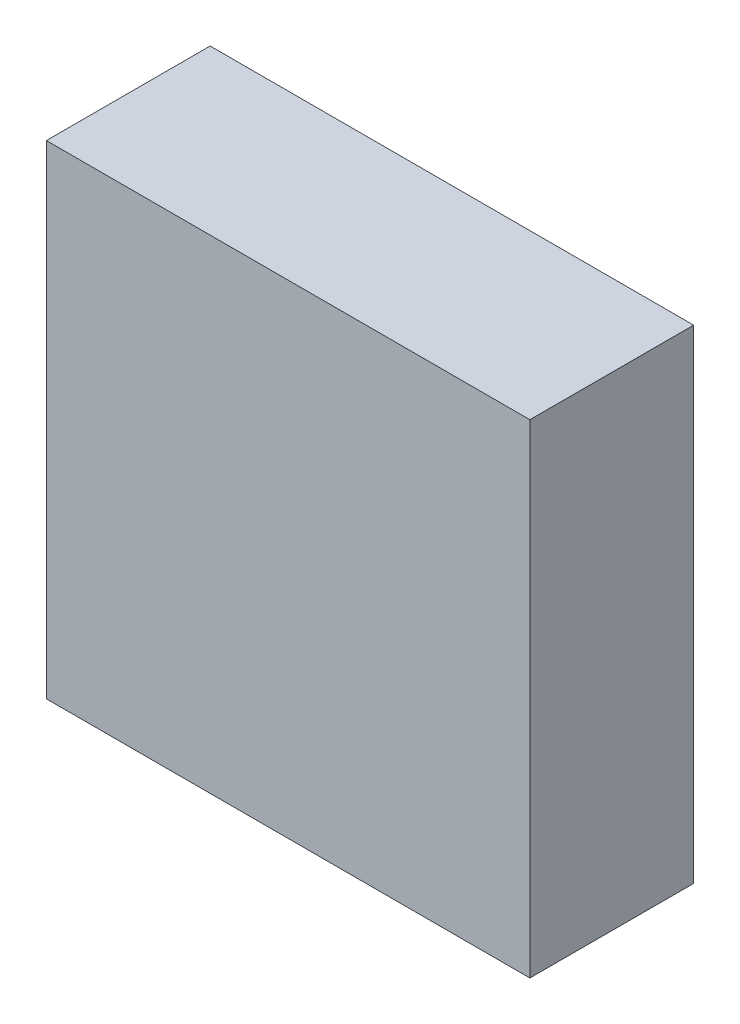
ISO-10303-21;
HEADER;
FILE_DESCRIPTION(('STEP AP214'),'2;1');
FILE_NAME('part.step','',(''),(''),'','','');
FILE_SCHEMA(('AUTOMOTIVE_DESIGN { 1 0 10303 214 1 1 1 1 }'));
ENDSEC;
DATA;
#1=APPLICATION_CONTEXT('core data for automotive mechanical design processes');
#2=APPLICATION_PROTOCOL_DEFINITION('international standard','automotive_design',2000,#1);
#3=PRODUCT_CONTEXT('',#1,'mechanical');
#4=PRODUCT('Part','Part','',(#3));
#5=PRODUCT_RELATED_PRODUCT_CATEGORY('part','',(#4));
#6=PRODUCT_DEFINITION_FORMATION('','',#4);
#7=PRODUCT_DEFINITION_CONTEXT('part definition',#1,'design');
#8=PRODUCT_DEFINITION('design','',#6,#7);
#9=PRODUCT_DEFINITION_SHAPE('','',#8);
#10=(LENGTH_UNIT() NAMED_UNIT(*) SI_UNIT(.MILLI.,.METRE.));
#11=(NAMED_UNIT(*) PLANE_ANGLE_UNIT() SI_UNIT($,.RADIAN.));
#12=(NAMED_UNIT(*) SI_UNIT($,.STERADIAN.) SOLID_ANGLE_UNIT());
#13=UNCERTAINTY_MEASURE_WITH_UNIT(LENGTH_MEASURE(1.E-05),#10,'distance_accuracy_value','');
#14=(GEOMETRIC_REPRESENTATION_CONTEXT(3) GLOBAL_UNCERTAINTY_ASSIGNED_CONTEXT((#13)) GLOBAL_UNIT_ASSIGNED_CONTEXT((#10,
#11,#12)) REPRESENTATION_CONTEXT('',''));
#15=CARTESIAN_POINT('',(0.,0.,0.));
#16=DIRECTION('',(0.,0.,1.));
#17=DIRECTION('',(1.,0.,0.));
#18=AXIS2_PLACEMENT_3D('',#15,#16,#17);
#19=CARTESIAN_POINT('',(-1.54999944,-1.54999944,1.05000044));
#20=DIRECTION('',(0.,0.,-1.));
#21=DIRECTION('',(-1.,0.,0.));
#22=AXIS2_PLACEMENT_3D('',#19,#20,#21);
#23=PLANE('',#22);
#24=DIRECTION('',(0.,1.,0.));
#25=VECTOR('',#24,1.);
#26=CARTESIAN_POINT('',(1.54999944,-1.54999944,1.05000044));
#27=LINE('',#26,#25);
#28=CARTESIAN_POINT('',(1.54999944,-1.54999944,1.05000044));
#29=VERTEX_POINT('',#28);
#30=CARTESIAN_POINT('',(1.54999944,1.55000198,1.05000044));
#31=VERTEX_POINT('',#30);
#32=EDGE_CURVE('E55',#29,#31,#27,.T.);
#33=ORIENTED_EDGE('',*,*,#32,.T.);
#34=DIRECTION('',(1.,0.,0.));
#35=VECTOR('',#34,1.);
#36=CARTESIAN_POINT('',(1.54999944,1.55000198,1.05000044));
#37=LINE('',#36,#35);
#38=CARTESIAN_POINT('',(-1.54999944,1.55000198,1.05000044));
#39=VERTEX_POINT('',#38);
#40=EDGE_CURVE('E57',#31,#39,#37,.F.);
#41=ORIENTED_EDGE('',*,*,#40,.T.);
#42=DIRECTION('',(0.,1.,0.));
#43=VECTOR('',#42,1.);
#44=CARTESIAN_POINT('',(-1.54999944,1.55000198,1.05000044));
#45=LINE('',#44,#43);
#46=CARTESIAN_POINT('',(-1.54999944,-1.54999944,1.05000044));
#47=VERTEX_POINT('',#46);
#48=EDGE_CURVE('E20',#39,#47,#45,.F.);
#49=ORIENTED_EDGE('',*,*,#48,.T.);
#50=DIRECTION('',(1.,0.,0.));
#51=VECTOR('',#50,1.);
#52=CARTESIAN_POINT('',(-1.54999944,-1.54999944,1.05000044));
#53=LINE('',#52,#51);
#54=EDGE_CURVE('E80',#47,#29,#53,.T.);
#55=ORIENTED_EDGE('',*,*,#54,.T.);
#56=EDGE_LOOP('',(#33,#41,#49,#55));
#57=FACE_BOUND('',#56,.T.);
#58=ADVANCED_FACE('F17',(#57),#23,.F.);
#59=CARTESIAN_POINT('',(-1.54999944,1.55000198,0.));
#60=DIRECTION('',(1.,0.,0.));
#61=DIRECTION('',(0.,0.,-1.));
#62=AXIS2_PLACEMENT_3D('',#59,#60,#61);
#63=PLANE('',#62);
#64=DIRECTION('',(0.,0.,1.));
#65=VECTOR('',#64,1.);
#66=CARTESIAN_POINT('',(-1.54999944,-1.54999944,0.));
#67=LINE('',#66,#65);
#68=CARTESIAN_POINT('',(-1.54999944,-1.54999944,0.));
#69=VERTEX_POINT('',#68);
#70=EDGE_CURVE('E68',#69,#47,#67,.T.);
#71=ORIENTED_EDGE('',*,*,#70,.T.);
#72=ORIENTED_EDGE('',*,*,#48,.F.);
#73=DIRECTION('',(0.,0.,-1.));
#74=VECTOR('',#73,1.);
#75=CARTESIAN_POINT('',(-1.54999944,1.55000198,0.));
#76=LINE('',#75,#74);
#77=CARTESIAN_POINT('',(-1.54999944,1.55000198,0.));
#78=VERTEX_POINT('',#77);
#79=EDGE_CURVE('E63',#39,#78,#76,.T.);
#80=ORIENTED_EDGE('',*,*,#79,.T.);
#81=DIRECTION('',(0.,1.,0.));
#82=VECTOR('',#81,1.);
#83=CARTESIAN_POINT('',(-1.54999944,-1.54999944,0.));
#84=LINE('',#83,#82);
#85=EDGE_CURVE('E83',#69,#78,#84,.T.);
#86=ORIENTED_EDGE('',*,*,#85,.F.);
#87=EDGE_LOOP('',(#71,#72,#80,#86));
#88=FACE_BOUND('',#87,.T.);
#89=ADVANCED_FACE('F65',(#88),#63,.F.);
#90=CARTESIAN_POINT('',(1.54999944,1.55000198,0.));
#91=DIRECTION('',(0.,-1.,0.));
#92=DIRECTION('',(0.,0.,-1.));
#93=AXIS2_PLACEMENT_3D('',#90,#91,#92);
#94=PLANE('',#93);
#95=ORIENTED_EDGE('',*,*,#79,.F.);
#96=ORIENTED_EDGE('',*,*,#40,.F.);
#97=DIRECTION('',(0.,0.,1.));
#98=VECTOR('',#97,1.);
#99=CARTESIAN_POINT('',(1.54999944,1.55000198,0.));
#100=LINE('',#99,#98);
#101=CARTESIAN_POINT('',(1.54999944,1.55000198,0.));
#102=VERTEX_POINT('',#101);
#103=EDGE_CURVE('E75',#31,#102,#100,.F.);
#104=ORIENTED_EDGE('',*,*,#103,.T.);
#105=DIRECTION('',(-1.,0.,0.));
#106=VECTOR('',#105,1.);
#107=CARTESIAN_POINT('',(-1.54999944,1.55000198,0.));
#108=LINE('',#107,#106);
#109=EDGE_CURVE('E72',#78,#102,#108,.F.);
#110=ORIENTED_EDGE('',*,*,#109,.F.);
#111=EDGE_LOOP('',(#95,#96,#104,#110));
#112=FACE_BOUND('',#111,.T.);
#113=ADVANCED_FACE('F70',(#112),#94,.F.);
#114=CARTESIAN_POINT('',(1.54999944,-1.54999944,0.));
#115=DIRECTION('',(-1.,0.,0.));
#116=DIRECTION('',(0.,0.,1.));
#117=AXIS2_PLACEMENT_3D('',#114,#115,#116);
#118=PLANE('',#117);
#119=ORIENTED_EDGE('',*,*,#103,.F.);
#120=ORIENTED_EDGE('',*,*,#32,.F.);
#121=DIRECTION('',(0.,0.,1.));
#122=VECTOR('',#121,1.);
#123=CARTESIAN_POINT('',(1.54999944,-1.54999944,0.));
#124=LINE('',#123,#122);
#125=CARTESIAN_POINT('',(1.54999944,-1.54999944,0.));
#126=VERTEX_POINT('',#125);
#127=EDGE_CURVE('E35',#29,#126,#124,.F.);
#128=ORIENTED_EDGE('',*,*,#127,.T.);
#129=DIRECTION('',(0.,1.,0.));
#130=VECTOR('',#129,1.);
#131=CARTESIAN_POINT('',(1.54999944,-1.54999944,0.));
#132=LINE('',#131,#130);
#133=EDGE_CURVE('E26',#102,#126,#132,.F.);
#134=ORIENTED_EDGE('',*,*,#133,.F.);
#135=EDGE_LOOP('',(#119,#120,#128,#134));
#136=FACE_BOUND('',#135,.T.);
#137=ADVANCED_FACE('F89',(#136),#118,.F.);
#138=CARTESIAN_POINT('',(-1.54999944,-1.54999944,0.));
#139=DIRECTION('',(0.,1.,0.));
#140=DIRECTION('',(0.,0.,1.));
#141=AXIS2_PLACEMENT_3D('',#138,#139,#140);
#142=PLANE('',#141);
#143=ORIENTED_EDGE('',*,*,#127,.F.);
#144=ORIENTED_EDGE('',*,*,#54,.F.);
#145=ORIENTED_EDGE('',*,*,#70,.F.);
#146=DIRECTION('',(-1.,0.,0.));
#147=VECTOR('',#146,1.);
#148=CARTESIAN_POINT('',(-1.54999944,-1.54999944,0.));
#149=LINE('',#148,#147);
#150=EDGE_CURVE('E11',#126,#69,#149,.T.);
#151=ORIENTED_EDGE('',*,*,#150,.F.);
#152=EDGE_LOOP('',(#143,#144,#145,#151));
#153=FACE_BOUND('',#152,.T.);
#154=ADVANCED_FACE('F91',(#153),#142,.F.);
#155=CARTESIAN_POINT('',(-1.54999944,-1.54999944,0.));
#156=DIRECTION('',(0.,0.,-1.));
#157=DIRECTION('',(-1.,0.,0.));
#158=AXIS2_PLACEMENT_3D('',#155,#156,#157);
#159=PLANE('',#158);
#160=ORIENTED_EDGE('',*,*,#133,.T.);
#161=ORIENTED_EDGE('',*,*,#150,.T.);
#162=ORIENTED_EDGE('',*,*,#85,.T.);
#163=ORIENTED_EDGE('',*,*,#109,.T.);
#164=EDGE_LOOP('',(#160,#161,#162,#163));
#165=FACE_BOUND('',#164,.T.);
#166=ADVANCED_FACE('F88',(#165),#159,.T.);
#167=CLOSED_SHELL('',(#58,#89,#113,#137,#154,#166));
#168=MANIFOLD_SOLID_BREP('B1',#167);
#169=ADVANCED_BREP_SHAPE_REPRESENTATION('',(#18,#168),#14);
#170=SHAPE_DEFINITION_REPRESENTATION(#9,#169);
ENDSEC;
END-ISO-10303-21;
